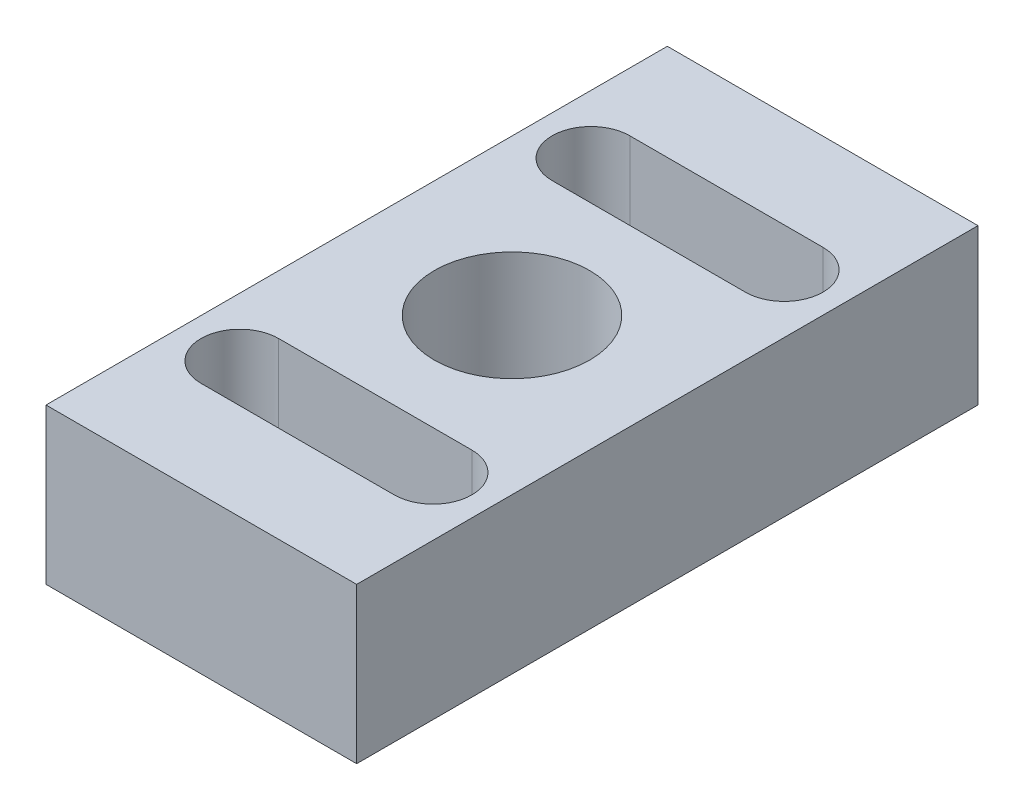
ISO-10303-21;
HEADER;
FILE_DESCRIPTION(('STEP AP214'),'2;1');
FILE_NAME('part.step','',(''),(''),'','','');
FILE_SCHEMA(('AUTOMOTIVE_DESIGN { 1 0 10303 214 1 1 1 1 }'));
ENDSEC;
DATA;
#1=APPLICATION_CONTEXT('core data for automotive mechanical design processes');
#2=APPLICATION_PROTOCOL_DEFINITION('international standard','automotive_design',2000,#1);
#3=PRODUCT_CONTEXT('',#1,'mechanical');
#4=PRODUCT('Part','Part','',(#3));
#5=PRODUCT_RELATED_PRODUCT_CATEGORY('part','',(#4));
#6=PRODUCT_DEFINITION_FORMATION('','',#4);
#7=PRODUCT_DEFINITION_CONTEXT('part definition',#1,'design');
#8=PRODUCT_DEFINITION('design','',#6,#7);
#9=PRODUCT_DEFINITION_SHAPE('','',#8);
#10=(LENGTH_UNIT() NAMED_UNIT(*) SI_UNIT(.MILLI.,.METRE.));
#11=(NAMED_UNIT(*) PLANE_ANGLE_UNIT() SI_UNIT($,.RADIAN.));
#12=(NAMED_UNIT(*) SI_UNIT($,.STERADIAN.) SOLID_ANGLE_UNIT());
#13=UNCERTAINTY_MEASURE_WITH_UNIT(LENGTH_MEASURE(1.E-05),#10,'distance_accuracy_value','');
#14=(GEOMETRIC_REPRESENTATION_CONTEXT(3) GLOBAL_UNCERTAINTY_ASSIGNED_CONTEXT((#13)) GLOBAL_UNIT_ASSIGNED_CONTEXT((#10,
#11,#12)) REPRESENTATION_CONTEXT('',''));
#15=CARTESIAN_POINT('',(0.,0.,0.));
#16=DIRECTION('',(0.,0.,1.));
#17=DIRECTION('',(1.,0.,0.));
#18=AXIS2_PLACEMENT_3D('',#15,#16,#17);
#19=CARTESIAN_POINT('',(0.,6.35,0.));
#20=DIRECTION('',(0.,-1.,0.));
#21=DIRECTION('',(0.,0.,-1.));
#22=AXIS2_PLACEMENT_3D('',#19,#20,#21);
#23=PLANE('',#22);
#24=DIRECTION('',(0.,0.,-1.));
#25=VECTOR('',#24,1.);
#26=CARTESIAN_POINT('',(6.35,6.35,12.7));
#27=LINE('',#26,#25);
#28=CARTESIAN_POINT('',(6.35,6.35,12.7));
#29=VERTEX_POINT('',#28);
#30=CARTESIAN_POINT('',(6.35,6.35,-12.7));
#31=VERTEX_POINT('',#30);
#32=EDGE_CURVE('E201',#29,#31,#27,.T.);
#33=ORIENTED_EDGE('',*,*,#32,.T.);
#34=DIRECTION('',(-1.,0.,0.));
#35=VECTOR('',#34,1.);
#36=CARTESIAN_POINT('',(-6.35,6.35,-12.7));
#37=LINE('',#36,#35);
#38=CARTESIAN_POINT('',(-6.35,6.35,-12.7));
#39=VERTEX_POINT('',#38);
#40=EDGE_CURVE('E204',#31,#39,#37,.T.);
#41=ORIENTED_EDGE('',*,*,#40,.T.);
#42=DIRECTION('',(0.,0.,1.));
#43=VECTOR('',#42,1.);
#44=CARTESIAN_POINT('',(-6.35,6.35,12.7));
#45=LINE('',#44,#43);
#46=CARTESIAN_POINT('',(-6.35,6.35,12.7));
#47=VERTEX_POINT('',#46);
#48=EDGE_CURVE('E207',#39,#47,#45,.T.);
#49=ORIENTED_EDGE('',*,*,#48,.T.);
#50=DIRECTION('',(1.,0.,0.));
#51=VECTOR('',#50,1.);
#52=CARTESIAN_POINT('',(-6.35,6.35,12.7));
#53=LINE('',#52,#51);
#54=EDGE_CURVE('E209',#47,#29,#53,.T.);
#55=ORIENTED_EDGE('',*,*,#54,.T.);
#56=EDGE_LOOP('',(#33,#41,#49,#55));
#57=FACE_BOUND('',#56,.T.);
#58=CARTESIAN_POINT('',(0.,6.35,0.));
#59=DIRECTION('',(0.,1.,0.));
#60=DIRECTION('',(0.,0.,1.));
#61=AXIS2_PLACEMENT_3D('',#58,#59,#60);
#62=CIRCLE('',#61,3.175);
#63=CARTESIAN_POINT('',(0.,6.35,3.175));
#64=VERTEX_POINT('',#63);
#65=EDGE_CURVE('E188',#64,#64,#62,.T.);
#66=ORIENTED_EDGE('',*,*,#65,.F.);
#67=EDGE_LOOP('',(#66));
#68=FACE_BOUND('',#67,.T.);
#69=DIRECTION('',(1.,0.,0.));
#70=VECTOR('',#69,1.);
#71=CARTESIAN_POINT('',(-3.94961840548289,6.35,-5.58960264138059));
#72=LINE('',#71,#70);
#73=CARTESIAN_POINT('',(-3.94961840548289,6.35,-5.58960264138059));
#74=VERTEX_POINT('',#73);
#75=CARTESIAN_POINT('',(3.94961840548289,6.35,-5.58960264138059));
#76=VERTEX_POINT('',#75);
#77=EDGE_CURVE('E178',#74,#76,#72,.T.);
#78=ORIENTED_EDGE('',*,*,#77,.F.);
#79=CARTESIAN_POINT('',(-3.94961840548289,6.35,-7.17710264138059));
#80=DIRECTION('',(0.,1.,0.));
#81=DIRECTION('',(0.,0.,1.));
#82=AXIS2_PLACEMENT_3D('',#79,#80,#81);
#83=CIRCLE('',#82,1.5875);
#84=CARTESIAN_POINT('',(-3.94961840548289,6.35,-8.76460264138059));
#85=VERTEX_POINT('',#84);
#86=EDGE_CURVE('E159',#85,#74,#83,.T.);
#87=ORIENTED_EDGE('',*,*,#86,.F.);
#88=DIRECTION('',(-1.,0.,0.));
#89=VECTOR('',#88,1.);
#90=CARTESIAN_POINT('',(-3.94961840548289,6.35,-8.76460264138059));
#91=LINE('',#90,#89);
#92=CARTESIAN_POINT('',(3.94961840548289,6.35,-8.76460264138059));
#93=VERTEX_POINT('',#92);
#94=EDGE_CURVE('E167',#93,#85,#91,.T.);
#95=ORIENTED_EDGE('',*,*,#94,.F.);
#96=CARTESIAN_POINT('',(3.94961840548289,6.35,-7.17710264138059));
#97=DIRECTION('',(0.,1.,0.));
#98=DIRECTION('',(0.,0.,1.));
#99=AXIS2_PLACEMENT_3D('',#96,#97,#98);
#100=CIRCLE('',#99,1.5875);
#101=EDGE_CURVE('E181',#76,#93,#100,.T.);
#102=ORIENTED_EDGE('',*,*,#101,.F.);
#103=EDGE_LOOP('',(#78,#87,#95,#102));
#104=FACE_BOUND('',#103,.T.);
#105=CARTESIAN_POINT('',(-3.94961840548289,6.35,7.17710264138059));
#106=DIRECTION('',(0.,-1.,0.));
#107=DIRECTION('',(0.,0.,-1.));
#108=AXIS2_PLACEMENT_3D('',#105,#106,#107);
#109=CIRCLE('',#108,1.5875);
#110=CARTESIAN_POINT('',(-3.94961840548289,6.35,8.76460264138059));
#111=VERTEX_POINT('',#110);
#112=CARTESIAN_POINT('',(-3.94961840548289,6.35,5.58960264138059));
#113=VERTEX_POINT('',#112);
#114=EDGE_CURVE('E54',#111,#113,#109,.T.);
#115=ORIENTED_EDGE('',*,*,#114,.T.);
#116=DIRECTION('',(1.,0.,0.));
#117=VECTOR('',#116,1.);
#118=CARTESIAN_POINT('',(-3.94961840548289,6.35,5.58960264138059));
#119=LINE('',#118,#117);
#120=CARTESIAN_POINT('',(3.94961840548289,6.35,5.58960264138059));
#121=VERTEX_POINT('',#120);
#122=EDGE_CURVE('E144',#113,#121,#119,.T.);
#123=ORIENTED_EDGE('',*,*,#122,.T.);
#124=CARTESIAN_POINT('',(3.94961840548289,6.35,7.17710264138059));
#125=DIRECTION('',(0.,-1.,0.));
#126=DIRECTION('',(0.,0.,-1.));
#127=AXIS2_PLACEMENT_3D('',#124,#125,#126);
#128=CIRCLE('',#127,1.5875);
#129=CARTESIAN_POINT('',(3.94961840548289,6.35,8.76460264138059));
#130=VERTEX_POINT('',#129);
#131=EDGE_CURVE('E147',#121,#130,#128,.T.);
#132=ORIENTED_EDGE('',*,*,#131,.T.);
#133=DIRECTION('',(-1.,0.,0.));
#134=VECTOR('',#133,1.);
#135=CARTESIAN_POINT('',(-3.94961840548289,6.35,8.76460264138059));
#136=LINE('',#135,#134);
#137=EDGE_CURVE('E153',#130,#111,#136,.T.);
#138=ORIENTED_EDGE('',*,*,#137,.T.);
#139=EDGE_LOOP('',(#115,#123,#132,#138));
#140=FACE_BOUND('',#139,.T.);
#141=ADVANCED_FACE('F39',(#57,#68,#104,#140),#23,.F.);
#142=CARTESIAN_POINT('',(0.,0.,0.));
#143=DIRECTION('',(0.,-1.,0.));
#144=DIRECTION('',(0.,0.,-1.));
#145=AXIS2_PLACEMENT_3D('',#142,#143,#144);
#146=PLANE('',#145);
#147=CARTESIAN_POINT('',(-3.94961840548289,0.,-7.17710264138059));
#148=DIRECTION('',(0.,1.,0.));
#149=DIRECTION('',(0.,0.,1.));
#150=AXIS2_PLACEMENT_3D('',#147,#148,#149);
#151=CIRCLE('',#150,1.5875);
#152=CARTESIAN_POINT('',(-3.94961840548289,0.,-8.76460264138059));
#153=VERTEX_POINT('',#152);
#154=CARTESIAN_POINT('',(-3.94961840548289,0.,-5.58960264138059));
#155=VERTEX_POINT('',#154);
#156=EDGE_CURVE('E163',#153,#155,#151,.T.);
#157=ORIENTED_EDGE('',*,*,#156,.T.);
#158=DIRECTION('',(1.,0.,0.));
#159=VECTOR('',#158,1.);
#160=CARTESIAN_POINT('',(-3.94961840548289,0.,-5.58960264138059));
#161=LINE('',#160,#159);
#162=CARTESIAN_POINT('',(3.94961840548289,0.,-5.58960264138059));
#163=VERTEX_POINT('',#162);
#164=EDGE_CURVE('E166',#155,#163,#161,.T.);
#165=ORIENTED_EDGE('',*,*,#164,.T.);
#166=CARTESIAN_POINT('',(3.94961840548289,0.,-7.17710264138059));
#167=DIRECTION('',(0.,1.,0.));
#168=DIRECTION('',(0.,0.,1.));
#169=AXIS2_PLACEMENT_3D('',#166,#167,#168);
#170=CIRCLE('',#169,1.5875);
#171=CARTESIAN_POINT('',(3.94961840548289,0.,-8.76460264138059));
#172=VERTEX_POINT('',#171);
#173=EDGE_CURVE('E170',#163,#172,#170,.T.);
#174=ORIENTED_EDGE('',*,*,#173,.T.);
#175=DIRECTION('',(-1.,0.,0.));
#176=VECTOR('',#175,1.);
#177=CARTESIAN_POINT('',(-3.94961840548289,0.,-8.76460264138059));
#178=LINE('',#177,#176);
#179=EDGE_CURVE('E173',#172,#153,#178,.T.);
#180=ORIENTED_EDGE('',*,*,#179,.T.);
#181=EDGE_LOOP('',(#157,#165,#174,#180));
#182=FACE_BOUND('',#181,.T.);
#183=CARTESIAN_POINT('',(0.,0.,0.));
#184=DIRECTION('',(0.,1.,0.));
#185=DIRECTION('',(0.,0.,1.));
#186=AXIS2_PLACEMENT_3D('',#183,#184,#185);
#187=CIRCLE('',#186,3.175);
#188=CARTESIAN_POINT('',(0.,0.,3.175));
#189=VERTEX_POINT('',#188);
#190=EDGE_CURVE('E195',#189,#189,#187,.T.);
#191=ORIENTED_EDGE('',*,*,#190,.T.);
#192=EDGE_LOOP('',(#191));
#193=FACE_BOUND('',#192,.T.);
#194=DIRECTION('',(0.,0.,-1.));
#195=VECTOR('',#194,1.);
#196=CARTESIAN_POINT('',(6.35,0.,12.7));
#197=LINE('',#196,#195);
#198=CARTESIAN_POINT('',(6.35,0.,12.7));
#199=VERTEX_POINT('',#198);
#200=CARTESIAN_POINT('',(6.35,0.,-12.7));
#201=VERTEX_POINT('',#200);
#202=EDGE_CURVE('E198',#199,#201,#197,.T.);
#203=ORIENTED_EDGE('',*,*,#202,.F.);
#204=DIRECTION('',(1.,0.,0.));
#205=VECTOR('',#204,1.);
#206=CARTESIAN_POINT('',(-6.35,0.,12.7));
#207=LINE('',#206,#205);
#208=CARTESIAN_POINT('',(-6.35,0.,12.7));
#209=VERTEX_POINT('',#208);
#210=EDGE_CURVE('E205',#209,#199,#207,.T.);
#211=ORIENTED_EDGE('',*,*,#210,.F.);
#212=DIRECTION('',(0.,0.,1.));
#213=VECTOR('',#212,1.);
#214=CARTESIAN_POINT('',(-6.35,0.,12.7));
#215=LINE('',#214,#213);
#216=CARTESIAN_POINT('',(-6.35,0.,-12.7));
#217=VERTEX_POINT('',#216);
#218=EDGE_CURVE('E216',#217,#209,#215,.T.);
#219=ORIENTED_EDGE('',*,*,#218,.F.);
#220=DIRECTION('',(-1.,0.,0.));
#221=VECTOR('',#220,1.);
#222=CARTESIAN_POINT('',(-6.35,0.,-12.7));
#223=LINE('',#222,#221);
#224=EDGE_CURVE('E214',#201,#217,#223,.T.);
#225=ORIENTED_EDGE('',*,*,#224,.F.);
#226=EDGE_LOOP('',(#203,#211,#219,#225));
#227=FACE_BOUND('',#226,.T.);
#228=DIRECTION('',(1.,0.,0.));
#229=VECTOR('',#228,1.);
#230=CARTESIAN_POINT('',(-3.94961840548289,0.,5.58960264138059));
#231=LINE('',#230,#229);
#232=CARTESIAN_POINT('',(-3.94961840548289,0.,5.58960264138059));
#233=VERTEX_POINT('',#232);
#234=CARTESIAN_POINT('',(3.94961840548289,0.,5.58960264138059));
#235=VERTEX_POINT('',#234);
#236=EDGE_CURVE('E140',#233,#235,#231,.T.);
#237=ORIENTED_EDGE('',*,*,#236,.F.);
#238=CARTESIAN_POINT('',(-3.94961840548289,0.,7.17710264138059));
#239=DIRECTION('',(0.,-1.,0.));
#240=DIRECTION('',(0.,0.,-1.));
#241=AXIS2_PLACEMENT_3D('',#238,#239,#240);
#242=CIRCLE('',#241,1.5875);
#243=CARTESIAN_POINT('',(-3.94961840548289,0.,8.76460264138059));
#244=VERTEX_POINT('',#243);
#245=EDGE_CURVE('E136',#244,#233,#242,.T.);
#246=ORIENTED_EDGE('',*,*,#245,.F.);
#247=DIRECTION('',(-1.,0.,0.));
#248=VECTOR('',#247,1.);
#249=CARTESIAN_POINT('',(-3.94961840548289,0.,8.76460264138059));
#250=LINE('',#249,#248);
#251=CARTESIAN_POINT('',(3.94961840548289,0.,8.76460264138059));
#252=VERTEX_POINT('',#251);
#253=EDGE_CURVE('E128',#252,#244,#250,.T.);
#254=ORIENTED_EDGE('',*,*,#253,.F.);
#255=CARTESIAN_POINT('',(3.94961840548289,0.,7.17710264138059));
#256=DIRECTION('',(0.,-1.,0.));
#257=DIRECTION('',(0.,0.,-1.));
#258=AXIS2_PLACEMENT_3D('',#255,#256,#257);
#259=CIRCLE('',#258,1.5875);
#260=EDGE_CURVE('E135',#235,#252,#259,.T.);
#261=ORIENTED_EDGE('',*,*,#260,.F.);
#262=EDGE_LOOP('',(#237,#246,#254,#261));
#263=FACE_BOUND('',#262,.T.);
#264=ADVANCED_FACE('F143',(#182,#193,#227,#263),#146,.T.);
#265=CARTESIAN_POINT('',(6.35,6.35,12.7));
#266=DIRECTION('',(-1.,0.,0.));
#267=DIRECTION('',(0.,0.,1.));
#268=AXIS2_PLACEMENT_3D('',#265,#266,#267);
#269=PLANE('',#268);
#270=ORIENTED_EDGE('',*,*,#202,.T.);
#271=DIRECTION('',(0.,-1.,0.));
#272=VECTOR('',#271,1.);
#273=CARTESIAN_POINT('',(6.35,6.35,-12.7));
#274=LINE('',#273,#272);
#275=EDGE_CURVE('E11',#31,#201,#274,.T.);
#276=ORIENTED_EDGE('',*,*,#275,.F.);
#277=ORIENTED_EDGE('',*,*,#32,.F.);
#278=DIRECTION('',(0.,-1.,0.));
#279=VECTOR('',#278,1.);
#280=CARTESIAN_POINT('',(6.35,6.35,12.7));
#281=LINE('',#280,#279);
#282=EDGE_CURVE('E211',#29,#199,#281,.T.);
#283=ORIENTED_EDGE('',*,*,#282,.T.);
#284=EDGE_LOOP('',(#270,#276,#277,#283));
#285=FACE_BOUND('',#284,.T.);
#286=ADVANCED_FACE('F41',(#285),#269,.F.);
#287=CARTESIAN_POINT('',(-6.35,6.35,-12.7));
#288=DIRECTION('',(0.,0.,1.));
#289=DIRECTION('',(1.,0.,0.));
#290=AXIS2_PLACEMENT_3D('',#287,#288,#289);
#291=PLANE('',#290);
#292=ORIENTED_EDGE('',*,*,#224,.T.);
#293=DIRECTION('',(0.,-1.,0.));
#294=VECTOR('',#293,1.);
#295=CARTESIAN_POINT('',(-6.35,6.35,-12.7));
#296=LINE('',#295,#294);
#297=EDGE_CURVE('E47',#39,#217,#296,.T.);
#298=ORIENTED_EDGE('',*,*,#297,.F.);
#299=ORIENTED_EDGE('',*,*,#40,.F.);
#300=ORIENTED_EDGE('',*,*,#275,.T.);
#301=EDGE_LOOP('',(#292,#298,#299,#300));
#302=FACE_BOUND('',#301,.T.);
#303=ADVANCED_FACE('F243',(#302),#291,.F.);
#304=CARTESIAN_POINT('',(-6.35,6.35,12.7));
#305=DIRECTION('',(1.,0.,0.));
#306=DIRECTION('',(0.,0.,-1.));
#307=AXIS2_PLACEMENT_3D('',#304,#305,#306);
#308=PLANE('',#307);
#309=ORIENTED_EDGE('',*,*,#218,.T.);
#310=DIRECTION('',(0.,-1.,0.));
#311=VECTOR('',#310,1.);
#312=CARTESIAN_POINT('',(-6.35,6.35,12.7));
#313=LINE('',#312,#311);
#314=EDGE_CURVE('E221',#47,#209,#313,.T.);
#315=ORIENTED_EDGE('',*,*,#314,.F.);
#316=ORIENTED_EDGE('',*,*,#48,.F.);
#317=ORIENTED_EDGE('',*,*,#297,.T.);
#318=EDGE_LOOP('',(#309,#315,#316,#317));
#319=FACE_BOUND('',#318,.T.);
#320=ADVANCED_FACE('F228',(#319),#308,.F.);
#321=CARTESIAN_POINT('',(-6.35,6.35,12.7));
#322=DIRECTION('',(0.,0.,-1.));
#323=DIRECTION('',(-1.,0.,0.));
#324=AXIS2_PLACEMENT_3D('',#321,#322,#323);
#325=PLANE('',#324);
#326=ORIENTED_EDGE('',*,*,#210,.T.);
#327=ORIENTED_EDGE('',*,*,#282,.F.);
#328=ORIENTED_EDGE('',*,*,#54,.F.);
#329=ORIENTED_EDGE('',*,*,#314,.T.);
#330=EDGE_LOOP('',(#326,#327,#328,#329));
#331=FACE_BOUND('',#330,.T.);
#332=ADVANCED_FACE('F236',(#331),#325,.F.);
#333=CARTESIAN_POINT('',(0.,0.,0.));
#334=DIRECTION('',(0.,1.,0.));
#335=DIRECTION('',(0.,0.,1.));
#336=AXIS2_PLACEMENT_3D('',#333,#334,#335);
#337=CYLINDRICAL_SURFACE('',#336,3.175);
#338=ORIENTED_EDGE('',*,*,#190,.F.);
#339=EDGE_LOOP('',(#338));
#340=FACE_BOUND('',#339,.T.);
#341=ORIENTED_EDGE('',*,*,#65,.T.);
#342=EDGE_LOOP('',(#341));
#343=FACE_BOUND('',#342,.T.);
#344=ADVANCED_FACE('F258',(#340,#343),#337,.F.);
#345=CARTESIAN_POINT('',(-3.94961840548289,0.,-7.17710264138059));
#346=DIRECTION('',(0.,1.,0.));
#347=DIRECTION('',(0.,0.,1.));
#348=AXIS2_PLACEMENT_3D('',#345,#346,#347);
#349=CYLINDRICAL_SURFACE('',#348,1.5875);
#350=ORIENTED_EDGE('',*,*,#86,.T.);
#351=DIRECTION('',(0.,1.,0.));
#352=VECTOR('',#351,1.);
#353=CARTESIAN_POINT('',(-3.94961840548289,0.,-5.58960264138059));
#354=LINE('',#353,#352);
#355=EDGE_CURVE('E176',#155,#74,#354,.T.);
#356=ORIENTED_EDGE('',*,*,#355,.F.);
#357=ORIENTED_EDGE('',*,*,#156,.F.);
#358=DIRECTION('',(0.,1.,0.));
#359=VECTOR('',#358,1.);
#360=CARTESIAN_POINT('',(-3.94961840548289,0.,-8.76460264138059));
#361=LINE('',#360,#359);
#362=EDGE_CURVE('E186',#153,#85,#361,.T.);
#363=ORIENTED_EDGE('',*,*,#362,.T.);
#364=EDGE_LOOP('',(#350,#356,#357,#363));
#365=FACE_BOUND('',#364,.T.);
#366=ADVANCED_FACE('F265',(#365),#349,.F.);
#367=CARTESIAN_POINT('',(-3.94961840548289,0.,-8.76460264138059));
#368=DIRECTION('',(0.,0.,-1.));
#369=DIRECTION('',(-1.,0.,0.));
#370=AXIS2_PLACEMENT_3D('',#367,#368,#369);
#371=PLANE('',#370);
#372=ORIENTED_EDGE('',*,*,#94,.T.);
#373=ORIENTED_EDGE('',*,*,#362,.F.);
#374=ORIENTED_EDGE('',*,*,#179,.F.);
#375=DIRECTION('',(0.,1.,0.));
#376=VECTOR('',#375,1.);
#377=CARTESIAN_POINT('',(3.94961840548289,0.,-8.76460264138059));
#378=LINE('',#377,#376);
#379=EDGE_CURVE('E189',#172,#93,#378,.T.);
#380=ORIENTED_EDGE('',*,*,#379,.T.);
#381=EDGE_LOOP('',(#372,#373,#374,#380));
#382=FACE_BOUND('',#381,.T.);
#383=ADVANCED_FACE('F270',(#382),#371,.F.);
#384=CARTESIAN_POINT('',(3.94961840548289,0.,-7.17710264138059));
#385=DIRECTION('',(0.,1.,0.));
#386=DIRECTION('',(0.,0.,1.));
#387=AXIS2_PLACEMENT_3D('',#384,#385,#386);
#388=CYLINDRICAL_SURFACE('',#387,1.5875);
#389=ORIENTED_EDGE('',*,*,#101,.T.);
#390=ORIENTED_EDGE('',*,*,#379,.F.);
#391=ORIENTED_EDGE('',*,*,#173,.F.);
#392=DIRECTION('',(0.,1.,0.));
#393=VECTOR('',#392,1.);
#394=CARTESIAN_POINT('',(3.94961840548289,0.,-5.58960264138059));
#395=LINE('',#394,#393);
#396=EDGE_CURVE('E191',#163,#76,#395,.T.);
#397=ORIENTED_EDGE('',*,*,#396,.T.);
#398=EDGE_LOOP('',(#389,#390,#391,#397));
#399=FACE_BOUND('',#398,.T.);
#400=ADVANCED_FACE('F300',(#399),#388,.F.);
#401=CARTESIAN_POINT('',(-3.94961840548289,0.,-5.58960264138059));
#402=DIRECTION('',(0.,0.,1.));
#403=DIRECTION('',(1.,0.,0.));
#404=AXIS2_PLACEMENT_3D('',#401,#402,#403);
#405=PLANE('',#404);
#406=ORIENTED_EDGE('',*,*,#77,.T.);
#407=ORIENTED_EDGE('',*,*,#396,.F.);
#408=ORIENTED_EDGE('',*,*,#164,.F.);
#409=ORIENTED_EDGE('',*,*,#355,.T.);
#410=EDGE_LOOP('',(#406,#407,#408,#409));
#411=FACE_BOUND('',#410,.T.);
#412=ADVANCED_FACE('F293',(#411),#405,.F.);
#413=CARTESIAN_POINT('',(-3.94961840548289,0.,7.17710264138059));
#414=DIRECTION('',(0.,1.,0.));
#415=DIRECTION('',(0.,0.,1.));
#416=AXIS2_PLACEMENT_3D('',#413,#414,#415);
#417=CYLINDRICAL_SURFACE('',#416,1.5875);
#418=ORIENTED_EDGE('',*,*,#114,.F.);
#419=DIRECTION('',(0.,1.,0.));
#420=VECTOR('',#419,1.);
#421=CARTESIAN_POINT('',(-3.94961840548289,0.,8.76460264138059));
#422=LINE('',#421,#420);
#423=EDGE_CURVE('E130',#244,#111,#422,.T.);
#424=ORIENTED_EDGE('',*,*,#423,.F.);
#425=ORIENTED_EDGE('',*,*,#245,.T.);
#426=DIRECTION('',(0.,1.,0.));
#427=VECTOR('',#426,1.);
#428=CARTESIAN_POINT('',(-3.94961840548289,0.,5.58960264138059));
#429=LINE('',#428,#427);
#430=EDGE_CURVE('E157',#233,#113,#429,.T.);
#431=ORIENTED_EDGE('',*,*,#430,.T.);
#432=EDGE_LOOP('',(#418,#424,#425,#431));
#433=FACE_BOUND('',#432,.T.);
#434=ADVANCED_FACE('F138',(#433),#417,.F.);
#435=CARTESIAN_POINT('',(-3.94961840548289,0.,5.58960264138059));
#436=DIRECTION('',(0.,0.,1.));
#437=DIRECTION('',(1.,0.,0.));
#438=AXIS2_PLACEMENT_3D('',#435,#436,#437);
#439=PLANE('',#438);
#440=ORIENTED_EDGE('',*,*,#122,.F.);
#441=ORIENTED_EDGE('',*,*,#430,.F.);
#442=ORIENTED_EDGE('',*,*,#236,.T.);
#443=DIRECTION('',(0.,1.,0.));
#444=VECTOR('',#443,1.);
#445=CARTESIAN_POINT('',(3.94961840548289,0.,5.58960264138059));
#446=LINE('',#445,#444);
#447=EDGE_CURVE('E160',#235,#121,#446,.T.);
#448=ORIENTED_EDGE('',*,*,#447,.T.);
#449=EDGE_LOOP('',(#440,#441,#442,#448));
#450=FACE_BOUND('',#449,.T.);
#451=ADVANCED_FACE('F285',(#450),#439,.T.);
#452=CARTESIAN_POINT('',(3.94961840548289,0.,7.17710264138059));
#453=DIRECTION('',(0.,1.,0.));
#454=DIRECTION('',(0.,0.,1.));
#455=AXIS2_PLACEMENT_3D('',#452,#453,#454);
#456=CYLINDRICAL_SURFACE('',#455,1.5875);
#457=ORIENTED_EDGE('',*,*,#131,.F.);
#458=ORIENTED_EDGE('',*,*,#447,.F.);
#459=ORIENTED_EDGE('',*,*,#260,.T.);
#460=DIRECTION('',(0.,1.,0.));
#461=VECTOR('',#460,1.);
#462=CARTESIAN_POINT('',(3.94961840548289,0.,8.76460264138059));
#463=LINE('',#462,#461);
#464=EDGE_CURVE('E62',#252,#130,#463,.T.);
#465=ORIENTED_EDGE('',*,*,#464,.T.);
#466=EDGE_LOOP('',(#457,#458,#459,#465));
#467=FACE_BOUND('',#466,.T.);
#468=ADVANCED_FACE('F283',(#467),#456,.F.);
#469=CARTESIAN_POINT('',(-3.94961840548289,0.,8.76460264138059));
#470=DIRECTION('',(0.,0.,-1.));
#471=DIRECTION('',(-1.,0.,0.));
#472=AXIS2_PLACEMENT_3D('',#469,#470,#471);
#473=PLANE('',#472);
#474=ORIENTED_EDGE('',*,*,#137,.F.);
#475=ORIENTED_EDGE('',*,*,#464,.F.);
#476=ORIENTED_EDGE('',*,*,#253,.T.);
#477=ORIENTED_EDGE('',*,*,#423,.T.);
#478=EDGE_LOOP('',(#474,#475,#476,#477));
#479=FACE_BOUND('',#478,.T.);
#480=ADVANCED_FACE('F129',(#479),#473,.T.);
#481=CLOSED_SHELL('',(#141,#264,#286,#303,#320,#332,#344,#366,#383,#400,#412,#434,#451,#468,#480));
#482=MANIFOLD_SOLID_BREP('B2',#481);
#483=ADVANCED_BREP_SHAPE_REPRESENTATION('',(#18,#482),#14);
#484=SHAPE_DEFINITION_REPRESENTATION(#9,#483);
ENDSEC;
END-ISO-10303-21;
